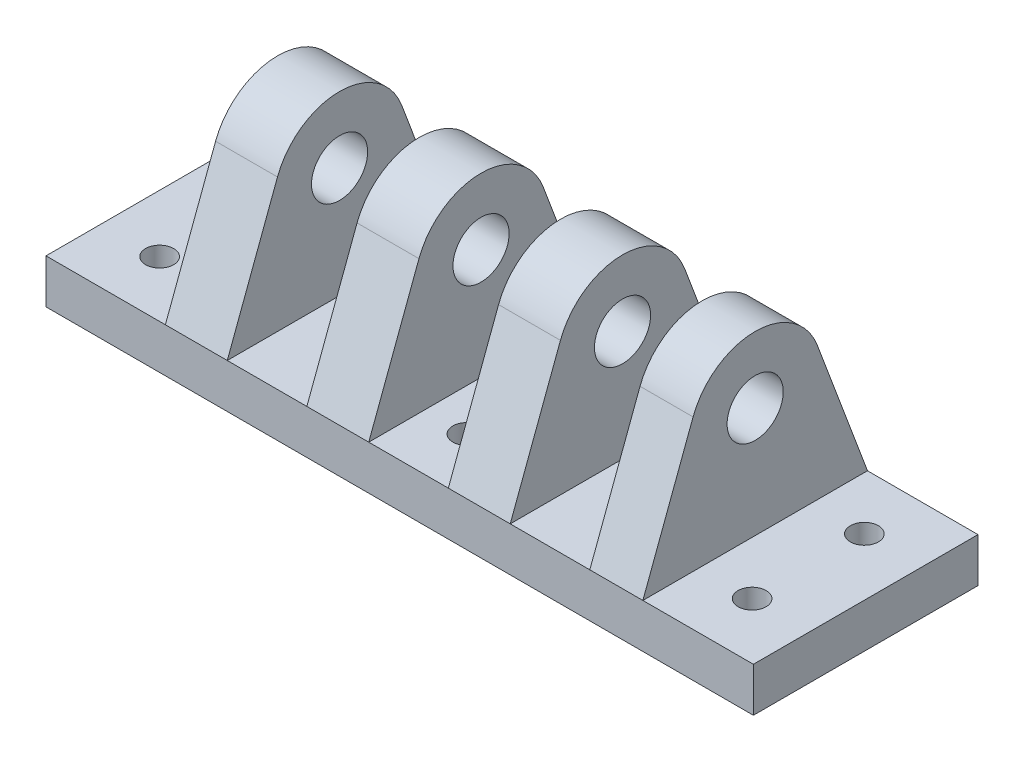
ISO-10303-21;
HEADER;
FILE_DESCRIPTION(('STEP AP214'),'2;1');
FILE_NAME('part.step','',(''),(''),'','','');
FILE_SCHEMA(('AUTOMOTIVE_DESIGN { 1 0 10303 214 1 1 1 1 }'));
ENDSEC;
DATA;
#1=APPLICATION_CONTEXT('core data for automotive mechanical design processes');
#2=APPLICATION_PROTOCOL_DEFINITION('international standard','automotive_design',2000,#1);
#3=PRODUCT_CONTEXT('',#1,'mechanical');
#4=PRODUCT('Part','Part','',(#3));
#5=PRODUCT_RELATED_PRODUCT_CATEGORY('part','',(#4));
#6=PRODUCT_DEFINITION_FORMATION('','',#4);
#7=PRODUCT_DEFINITION_CONTEXT('part definition',#1,'design');
#8=PRODUCT_DEFINITION('design','',#6,#7);
#9=PRODUCT_DEFINITION_SHAPE('','',#8);
#10=(LENGTH_UNIT() NAMED_UNIT(*) SI_UNIT(.MILLI.,.METRE.));
#11=(NAMED_UNIT(*) PLANE_ANGLE_UNIT() SI_UNIT($,.RADIAN.));
#12=(NAMED_UNIT(*) SI_UNIT($,.STERADIAN.) SOLID_ANGLE_UNIT());
#13=UNCERTAINTY_MEASURE_WITH_UNIT(LENGTH_MEASURE(1.E-05),#10,'distance_accuracy_value','');
#14=(GEOMETRIC_REPRESENTATION_CONTEXT(3) GLOBAL_UNCERTAINTY_ASSIGNED_CONTEXT((#13)) GLOBAL_UNIT_ASSIGNED_CONTEXT((#10,
#11,#12)) REPRESENTATION_CONTEXT('',''));
#15=CARTESIAN_POINT('',(0.,0.,0.));
#16=DIRECTION('',(0.,0.,1.));
#17=DIRECTION('',(1.,0.,0.));
#18=AXIS2_PLACEMENT_3D('',#15,#16,#17);
#19=CARTESIAN_POINT('',(160.,10.,-50.8));
#20=DIRECTION('',(0.,0.351258844539415,-0.9362783902947));
#21=DIRECTION('',(0.,0.9362783902947,0.351258844539415));
#22=AXIS2_PLACEMENT_3D('',#19,#20,#21);
#23=PLANE('',#22);
#24=DIRECTION('',(0.,-0.9362783902947,-0.351258844539415));
#25=VECTOR('',#24,1.);
#26=CARTESIAN_POINT('',(27.,10.,-50.8));
#27=LINE('',#26,#25);
#28=CARTESIAN_POINT('',(27.,40.2688826680913,-39.4441758544205));
#29=VERTEX_POINT('',#28);
#30=CARTESIAN_POINT('',(27.,10.,-50.8));
#31=VERTEX_POINT('',#30);
#32=EDGE_CURVE('E185',#29,#31,#27,.T.);
#33=ORIENTED_EDGE('',*,*,#32,.F.);
#34=DIRECTION('',(-1.,0.,0.));
#35=VECTOR('',#34,1.);
#36=CARTESIAN_POINT('',(160.,40.2688826680912,-39.4441758544205));
#37=LINE('',#36,#35);
#38=CARTESIAN_POINT('',(41.,40.2688826680913,-39.4441758544205));
#39=VERTEX_POINT('',#38);
#40=EDGE_CURVE('E290',#39,#29,#37,.T.);
#41=ORIENTED_EDGE('',*,*,#40,.F.);
#42=DIRECTION('',(0.,0.9362783902947,0.351258844539415));
#43=VECTOR('',#42,1.);
#44=CARTESIAN_POINT('',(41.,9.99999999999999,-50.8));
#45=LINE('',#44,#43);
#46=CARTESIAN_POINT('',(41.,10.,-50.8));
#47=VERTEX_POINT('',#46);
#48=EDGE_CURVE('E287',#47,#39,#45,.T.);
#49=ORIENTED_EDGE('',*,*,#48,.F.);
#50=DIRECTION('',(-1.,0.,0.));
#51=VECTOR('',#50,1.);
#52=CARTESIAN_POINT('',(0.,10.,-50.8));
#53=LINE('',#52,#51);
#54=EDGE_CURVE('E198',#47,#31,#53,.T.);
#55=ORIENTED_EDGE('',*,*,#54,.T.);
#56=EDGE_LOOP('',(#33,#41,#49,#55));
#57=FACE_BOUND('',#56,.T.);
#58=ADVANCED_FACE('F37',(#57),#23,.T.);
#59=DIRECTION('',(0.,-0.9362783902947,-0.351258844539415));
#60=VECTOR('',#59,1.);
#61=CARTESIAN_POINT('',(59.,10.,-50.8));
#62=LINE('',#61,#60);
#63=CARTESIAN_POINT('',(59.,40.2688826680913,-39.4441758544205));
#64=VERTEX_POINT('',#63);
#65=CARTESIAN_POINT('',(59.,10.,-50.8));
#66=VERTEX_POINT('',#65);
#67=EDGE_CURVE('E272',#64,#66,#62,.T.);
#68=ORIENTED_EDGE('',*,*,#67,.F.);
#69=CARTESIAN_POINT('',(73.,40.2688826680913,-39.4441758544205));
#70=VERTEX_POINT('',#69);
#71=EDGE_CURVE('E292',#70,#64,#37,.T.);
#72=ORIENTED_EDGE('',*,*,#71,.F.);
#73=DIRECTION('',(0.,0.9362783902947,0.351258844539415));
#74=VECTOR('',#73,1.);
#75=CARTESIAN_POINT('',(73.,10.,-50.8));
#76=LINE('',#75,#74);
#77=CARTESIAN_POINT('',(73.,10.,-50.8));
#78=VERTEX_POINT('',#77);
#79=EDGE_CURVE('E268',#78,#70,#76,.T.);
#80=ORIENTED_EDGE('',*,*,#79,.F.);
#81=EDGE_CURVE('E414',#78,#66,#53,.T.);
#82=ORIENTED_EDGE('',*,*,#81,.T.);
#83=EDGE_LOOP('',(#68,#72,#80,#82));
#84=FACE_BOUND('',#83,.T.);
#85=ADVANCED_FACE('F457',(#84),#23,.T.);
#86=DIRECTION('',(0.,-0.9362783902947,-0.351258844539415));
#87=VECTOR('',#86,1.);
#88=CARTESIAN_POINT('',(91.,10.,-50.8));
#89=LINE('',#88,#87);
#90=CARTESIAN_POINT('',(91.,40.2688826680913,-39.4441758544205));
#91=VERTEX_POINT('',#90);
#92=CARTESIAN_POINT('',(91.,10.,-50.8));
#93=VERTEX_POINT('',#92);
#94=EDGE_CURVE('E264',#91,#93,#89,.T.);
#95=ORIENTED_EDGE('',*,*,#94,.F.);
#96=CARTESIAN_POINT('',(105.,40.2688826680913,-39.4441758544205));
#97=VERTEX_POINT('',#96);
#98=EDGE_CURVE('E298',#97,#91,#37,.T.);
#99=ORIENTED_EDGE('',*,*,#98,.F.);
#100=DIRECTION('',(0.,0.9362783902947,0.351258844539415));
#101=VECTOR('',#100,1.);
#102=CARTESIAN_POINT('',(105.,10.,-50.8));
#103=LINE('',#102,#101);
#104=CARTESIAN_POINT('',(105.,10.,-50.8));
#105=VERTEX_POINT('',#104);
#106=EDGE_CURVE('E259',#105,#97,#103,.T.);
#107=ORIENTED_EDGE('',*,*,#106,.F.);
#108=EDGE_CURVE('E320',#105,#93,#53,.T.);
#109=ORIENTED_EDGE('',*,*,#108,.T.);
#110=EDGE_LOOP('',(#95,#99,#107,#109));
#111=FACE_BOUND('',#110,.T.);
#112=ADVANCED_FACE('F317',(#111),#23,.T.);
#113=CARTESIAN_POINT('',(160.,35.,-25.4));
#114=DIRECTION('',(-1.,0.,0.));
#115=DIRECTION('',(0.,0.,1.));
#116=AXIS2_PLACEMENT_3D('',#113,#114,#115);
#117=CYLINDRICAL_SURFACE('',#116,15.);
#118=CARTESIAN_POINT('',(59.,35.,-25.4));
#119=DIRECTION('',(1.,0.,0.));
#120=DIRECTION('',(0.,0.,-1.));
#121=AXIS2_PLACEMENT_3D('',#118,#119,#120);
#122=CIRCLE('',#121,15.);
#123=CARTESIAN_POINT('',(59.,40.2688826680912,-11.3558241455795));
#124=VERTEX_POINT('',#123);
#125=EDGE_CURVE('E278',#124,#64,#122,.F.);
#126=ORIENTED_EDGE('',*,*,#125,.F.);
#127=DIRECTION('',(-1.,0.,0.));
#128=VECTOR('',#127,1.);
#129=CARTESIAN_POINT('',(160.,40.2688826680912,-11.3558241455795));
#130=LINE('',#129,#128);
#131=CARTESIAN_POINT('',(73.,40.2688826680912,-11.3558241455795));
#132=VERTEX_POINT('',#131);
#133=EDGE_CURVE('E340',#132,#124,#130,.T.);
#134=ORIENTED_EDGE('',*,*,#133,.F.);
#135=CARTESIAN_POINT('',(73.,35.,-25.4));
#136=DIRECTION('',(-1.,0.,0.));
#137=DIRECTION('',(0.,0.,1.));
#138=AXIS2_PLACEMENT_3D('',#135,#136,#137);
#139=CIRCLE('',#138,15.);
#140=EDGE_CURVE('E329',#70,#132,#139,.F.);
#141=ORIENTED_EDGE('',*,*,#140,.F.);
#142=ORIENTED_EDGE('',*,*,#71,.T.);
#143=EDGE_LOOP('',(#126,#134,#141,#142));
#144=FACE_BOUND('',#143,.T.);
#145=ADVANCED_FACE('F443',(#144),#117,.T.);
#146=CARTESIAN_POINT('',(91.,35.,-25.4));
#147=DIRECTION('',(1.,0.,0.));
#148=DIRECTION('',(0.,0.,-1.));
#149=AXIS2_PLACEMENT_3D('',#146,#147,#148);
#150=CIRCLE('',#149,15.);
#151=CARTESIAN_POINT('',(91.,40.2688826680912,-11.3558241455795));
#152=VERTEX_POINT('',#151);
#153=EDGE_CURVE('E311',#152,#91,#150,.F.);
#154=ORIENTED_EDGE('',*,*,#153,.F.);
#155=CARTESIAN_POINT('',(105.,40.2688826680912,-11.3558241455795));
#156=VERTEX_POINT('',#155);
#157=EDGE_CURVE('E300',#156,#152,#130,.T.);
#158=ORIENTED_EDGE('',*,*,#157,.F.);
#159=CARTESIAN_POINT('',(105.,35.,-25.4));
#160=DIRECTION('',(-1.,0.,0.));
#161=DIRECTION('',(0.,0.,1.));
#162=AXIS2_PLACEMENT_3D('',#159,#160,#161);
#163=CIRCLE('',#162,15.);
#164=EDGE_CURVE('E313',#97,#156,#163,.F.);
#165=ORIENTED_EDGE('',*,*,#164,.F.);
#166=ORIENTED_EDGE('',*,*,#98,.T.);
#167=EDGE_LOOP('',(#154,#158,#165,#166));
#168=FACE_BOUND('',#167,.T.);
#169=ADVANCED_FACE('F309',(#168),#117,.T.);
#170=CARTESIAN_POINT('',(123.,35.,-25.4));
#171=DIRECTION('',(1.,0.,0.));
#172=DIRECTION('',(0.,0.,-1.));
#173=AXIS2_PLACEMENT_3D('',#170,#171,#172);
#174=CIRCLE('',#173,15.);
#175=CARTESIAN_POINT('',(123.,40.2688826680912,-11.3558241455795));
#176=VERTEX_POINT('',#175);
#177=CARTESIAN_POINT('',(123.,40.2688826680913,-39.4441758544205));
#178=VERTEX_POINT('',#177);
#179=EDGE_CURVE('E398',#176,#178,#174,.F.);
#180=ORIENTED_EDGE('',*,*,#179,.F.);
#181=CARTESIAN_POINT('',(135.,40.2688826680912,-11.3558241455795));
#182=VERTEX_POINT('',#181);
#183=EDGE_CURVE('E293',#182,#176,#130,.T.);
#184=ORIENTED_EDGE('',*,*,#183,.F.);
#185=CARTESIAN_POINT('',(135.,35.,-25.4));
#186=DIRECTION('',(-1.,0.,0.));
#187=DIRECTION('',(0.,0.,1.));
#188=AXIS2_PLACEMENT_3D('',#185,#186,#187);
#189=CIRCLE('',#188,15.);
#190=CARTESIAN_POINT('',(135.,40.2688826680913,-39.4441758544205));
#191=VERTEX_POINT('',#190);
#192=EDGE_CURVE('E394',#191,#182,#189,.F.);
#193=ORIENTED_EDGE('',*,*,#192,.F.);
#194=EDGE_CURVE('E229',#191,#178,#37,.T.);
#195=ORIENTED_EDGE('',*,*,#194,.T.);
#196=EDGE_LOOP('',(#180,#184,#193,#195));
#197=FACE_BOUND('',#196,.T.);
#198=ADVANCED_FACE('F444',(#197),#117,.T.);
#199=CARTESIAN_POINT('',(160.,10.,0.));
#200=DIRECTION('',(0.,0.351258844539415,0.9362783902947));
#201=DIRECTION('',(0.,-0.936278390294701,0.351258844539415));
#202=AXIS2_PLACEMENT_3D('',#199,#200,#201);
#203=PLANE('',#202);
#204=DIRECTION('',(0.,0.936278390294701,-0.351258844539415));
#205=VECTOR('',#204,1.);
#206=CARTESIAN_POINT('',(27.,10.,0.));
#207=LINE('',#206,#205);
#208=CARTESIAN_POINT('',(27.,10.,0.));
#209=VERTEX_POINT('',#208);
#210=CARTESIAN_POINT('',(27.,40.2688826680912,-11.3558241455795));
#211=VERTEX_POINT('',#210);
#212=EDGE_CURVE('E182',#209,#211,#207,.T.);
#213=ORIENTED_EDGE('',*,*,#212,.F.);
#214=DIRECTION('',(1.,0.,0.));
#215=VECTOR('',#214,1.);
#216=CARTESIAN_POINT('',(0.,10.,0.));
#217=LINE('',#216,#215);
#218=CARTESIAN_POINT('',(41.,10.,0.));
#219=VERTEX_POINT('',#218);
#220=EDGE_CURVE('E199',#209,#219,#217,.T.);
#221=ORIENTED_EDGE('',*,*,#220,.T.);
#222=DIRECTION('',(0.,-0.936278390294701,0.351258844539415));
#223=VECTOR('',#222,1.);
#224=CARTESIAN_POINT('',(41.,9.99999999999998,0.));
#225=LINE('',#224,#223);
#226=CARTESIAN_POINT('',(41.,40.2688826680912,-11.3558241455795));
#227=VERTEX_POINT('',#226);
#228=EDGE_CURVE('E271',#227,#219,#225,.T.);
#229=ORIENTED_EDGE('',*,*,#228,.F.);
#230=EDGE_CURVE('E207',#227,#211,#130,.T.);
#231=ORIENTED_EDGE('',*,*,#230,.T.);
#232=EDGE_LOOP('',(#213,#221,#229,#231));
#233=FACE_BOUND('',#232,.T.);
#234=ADVANCED_FACE('F204',(#233),#203,.T.);
#235=DIRECTION('',(0.,0.936278390294701,-0.351258844539415));
#236=VECTOR('',#235,1.);
#237=CARTESIAN_POINT('',(59.,10.,0.));
#238=LINE('',#237,#236);
#239=CARTESIAN_POINT('',(59.,10.,0.));
#240=VERTEX_POINT('',#239);
#241=EDGE_CURVE('E267',#240,#124,#238,.T.);
#242=ORIENTED_EDGE('',*,*,#241,.F.);
#243=CARTESIAN_POINT('',(73.,10.,0.));
#244=VERTEX_POINT('',#243);
#245=EDGE_CURVE('E215',#240,#244,#217,.T.);
#246=ORIENTED_EDGE('',*,*,#245,.T.);
#247=DIRECTION('',(0.,-0.936278390294701,0.351258844539415));
#248=VECTOR('',#247,1.);
#249=CARTESIAN_POINT('',(73.,10.,0.));
#250=LINE('',#249,#248);
#251=EDGE_CURVE('E263',#132,#244,#250,.T.);
#252=ORIENTED_EDGE('',*,*,#251,.F.);
#253=ORIENTED_EDGE('',*,*,#133,.T.);
#254=EDGE_LOOP('',(#242,#246,#252,#253));
#255=FACE_BOUND('',#254,.T.);
#256=ADVANCED_FACE('F341',(#255),#203,.T.);
#257=DIRECTION('',(0.,0.936278390294701,-0.351258844539415));
#258=VECTOR('',#257,1.);
#259=CARTESIAN_POINT('',(91.,10.,0.));
#260=LINE('',#259,#258);
#261=CARTESIAN_POINT('',(91.,10.,0.));
#262=VERTEX_POINT('',#261);
#263=EDGE_CURVE('E258',#262,#152,#260,.T.);
#264=ORIENTED_EDGE('',*,*,#263,.F.);
#265=CARTESIAN_POINT('',(105.,10.,0.));
#266=VERTEX_POINT('',#265);
#267=EDGE_CURVE('E217',#262,#266,#217,.T.);
#268=ORIENTED_EDGE('',*,*,#267,.T.);
#269=DIRECTION('',(0.,-0.936278390294701,0.351258844539415));
#270=VECTOR('',#269,1.);
#271=CARTESIAN_POINT('',(105.,10.,0.));
#272=LINE('',#271,#270);
#273=EDGE_CURVE('E253',#156,#266,#272,.T.);
#274=ORIENTED_EDGE('',*,*,#273,.F.);
#275=ORIENTED_EDGE('',*,*,#157,.T.);
#276=EDGE_LOOP('',(#264,#268,#274,#275));
#277=FACE_BOUND('',#276,.T.);
#278=ADVANCED_FACE('F348',(#277),#203,.T.);
#279=CARTESIAN_POINT('',(0.,10.,0.));
#280=DIRECTION('',(1.,0.,0.));
#281=DIRECTION('',(0.,0.,-1.));
#282=AXIS2_PLACEMENT_3D('',#279,#280,#281);
#283=PLANE('',#282);
#284=DIRECTION('',(0.,-1.,0.));
#285=VECTOR('',#284,1.);
#286=CARTESIAN_POINT('',(0.,10.,0.));
#287=LINE('',#286,#285);
#288=CARTESIAN_POINT('',(0.,10.,0.));
#289=VERTEX_POINT('',#288);
#290=CARTESIAN_POINT('',(0.,0.,0.));
#291=VERTEX_POINT('',#290);
#292=EDGE_CURVE('E11',#289,#291,#287,.T.);
#293=ORIENTED_EDGE('',*,*,#292,.F.);
#294=DIRECTION('',(0.,0.,-1.));
#295=VECTOR('',#294,1.);
#296=CARTESIAN_POINT('',(0.,10.,0.));
#297=LINE('',#296,#295);
#298=CARTESIAN_POINT('',(0.,10.,-50.8));
#299=VERTEX_POINT('',#298);
#300=EDGE_CURVE('E189',#289,#299,#297,.T.);
#301=ORIENTED_EDGE('',*,*,#300,.T.);
#302=DIRECTION('',(0.,-1.,0.));
#303=VECTOR('',#302,1.);
#304=CARTESIAN_POINT('',(0.,10.,-50.8));
#305=LINE('',#304,#303);
#306=CARTESIAN_POINT('',(0.,0.,-50.8));
#307=VERTEX_POINT('',#306);
#308=EDGE_CURVE('E223',#299,#307,#305,.T.);
#309=ORIENTED_EDGE('',*,*,#308,.T.);
#310=DIRECTION('',(0.,0.,1.));
#311=VECTOR('',#310,1.);
#312=CARTESIAN_POINT('',(0.,0.,0.));
#313=LINE('',#312,#311);
#314=EDGE_CURVE('E225',#307,#291,#313,.T.);
#315=ORIENTED_EDGE('',*,*,#314,.T.);
#316=EDGE_LOOP('',(#293,#301,#309,#315));
#317=FACE_BOUND('',#316,.T.);
#318=ADVANCED_FACE('F39',(#317),#283,.F.);
#319=CARTESIAN_POINT('',(0.,10.,0.));
#320=DIRECTION('',(0.,0.,-1.));
#321=DIRECTION('',(-1.,0.,0.));
#322=AXIS2_PLACEMENT_3D('',#319,#320,#321);
#323=PLANE('',#322);
#324=DIRECTION('',(1.,0.,0.));
#325=VECTOR('',#324,1.);
#326=CARTESIAN_POINT('',(0.,0.,0.));
#327=LINE('',#326,#325);
#328=CARTESIAN_POINT('',(160.,0.,0.));
#329=VERTEX_POINT('',#328);
#330=EDGE_CURVE('E228',#291,#329,#327,.T.);
#331=ORIENTED_EDGE('',*,*,#330,.T.);
#332=DIRECTION('',(0.,-1.,0.));
#333=VECTOR('',#332,1.);
#334=CARTESIAN_POINT('',(160.,10.,0.));
#335=LINE('',#334,#333);
#336=CARTESIAN_POINT('',(160.,10.,0.));
#337=VERTEX_POINT('',#336);
#338=EDGE_CURVE('E46',#337,#329,#335,.T.);
#339=ORIENTED_EDGE('',*,*,#338,.F.);
#340=DIRECTION('',(-1.,0.,0.));
#341=VECTOR('',#340,1.);
#342=CARTESIAN_POINT('',(160.,10.,0.));
#343=LINE('',#342,#341);
#344=CARTESIAN_POINT('',(135.,10.,0.));
#345=VERTEX_POINT('',#344);
#346=EDGE_CURVE('E386',#337,#345,#343,.T.);
#347=ORIENTED_EDGE('',*,*,#346,.T.);
#348=CARTESIAN_POINT('',(123.,10.,0.));
#349=VERTEX_POINT('',#348);
#350=EDGE_CURVE('E201',#349,#345,#217,.T.);
#351=ORIENTED_EDGE('',*,*,#350,.F.);
#352=DIRECTION('',(-1.,0.,0.));
#353=VECTOR('',#352,1.);
#354=CARTESIAN_POINT('',(105.,10.,0.));
#355=LINE('',#354,#353);
#356=EDGE_CURVE('E378',#349,#266,#355,.T.);
#357=ORIENTED_EDGE('',*,*,#356,.T.);
#358=ORIENTED_EDGE('',*,*,#267,.F.);
#359=DIRECTION('',(-1.,0.,0.));
#360=VECTOR('',#359,1.);
#361=CARTESIAN_POINT('',(73.,10.,0.));
#362=LINE('',#361,#360);
#363=EDGE_CURVE('E366',#262,#244,#362,.T.);
#364=ORIENTED_EDGE('',*,*,#363,.T.);
#365=ORIENTED_EDGE('',*,*,#245,.F.);
#366=DIRECTION('',(-1.,0.,0.));
#367=VECTOR('',#366,1.);
#368=CARTESIAN_POINT('',(41.,10.,0.));
#369=LINE('',#368,#367);
#370=EDGE_CURVE('E214',#240,#219,#369,.T.);
#371=ORIENTED_EDGE('',*,*,#370,.T.);
#372=ORIENTED_EDGE('',*,*,#220,.F.);
#373=EDGE_CURVE('E192',#289,#209,#217,.T.);
#374=ORIENTED_EDGE('',*,*,#373,.F.);
#375=ORIENTED_EDGE('',*,*,#292,.T.);
#376=EDGE_LOOP('',(#331,#339,#347,#351,#357,#358,#364,#365,#371,#372,#374,#375));
#377=FACE_BOUND('',#376,.T.);
#378=ADVANCED_FACE('F211',(#377),#323,.F.);
#379=CARTESIAN_POINT('',(160.,10.,0.));
#380=DIRECTION('',(-1.,0.,0.));
#381=DIRECTION('',(0.,0.,1.));
#382=AXIS2_PLACEMENT_3D('',#379,#380,#381);
#383=PLANE('',#382);
#384=DIRECTION('',(0.,-1.,0.));
#385=VECTOR('',#384,1.);
#386=CARTESIAN_POINT('',(160.,10.,-50.8));
#387=LINE('',#386,#385);
#388=CARTESIAN_POINT('',(160.,10.,-50.8));
#389=VERTEX_POINT('',#388);
#390=CARTESIAN_POINT('',(160.,0.,-50.8));
#391=VERTEX_POINT('',#390);
#392=EDGE_CURVE('E237',#389,#391,#387,.T.);
#393=ORIENTED_EDGE('',*,*,#392,.F.);
#394=DIRECTION('',(0.,0.,-1.));
#395=VECTOR('',#394,1.);
#396=CARTESIAN_POINT('',(160.,10.,0.));
#397=LINE('',#396,#395);
#398=EDGE_CURVE('E389',#337,#389,#397,.T.);
#399=ORIENTED_EDGE('',*,*,#398,.F.);
#400=ORIENTED_EDGE('',*,*,#338,.T.);
#401=DIRECTION('',(0.,0.,-1.));
#402=VECTOR('',#401,1.);
#403=CARTESIAN_POINT('',(160.,0.,0.));
#404=LINE('',#403,#402);
#405=EDGE_CURVE('E231',#329,#391,#404,.T.);
#406=ORIENTED_EDGE('',*,*,#405,.T.);
#407=EDGE_LOOP('',(#393,#399,#400,#406));
#408=FACE_BOUND('',#407,.T.);
#409=ADVANCED_FACE('F580',(#408),#383,.F.);
#410=CARTESIAN_POINT('',(0.,10.,-50.8));
#411=DIRECTION('',(0.,0.,1.));
#412=DIRECTION('',(1.,0.,0.));
#413=AXIS2_PLACEMENT_3D('',#410,#411,#412);
#414=PLANE('',#413);
#415=DIRECTION('',(-1.,0.,0.));
#416=VECTOR('',#415,1.);
#417=CARTESIAN_POINT('',(0.,0.,-50.8));
#418=LINE('',#417,#416);
#419=EDGE_CURVE('E233',#391,#307,#418,.T.);
#420=ORIENTED_EDGE('',*,*,#419,.T.);
#421=ORIENTED_EDGE('',*,*,#308,.F.);
#422=DIRECTION('',(-1.,0.,0.));
#423=VECTOR('',#422,1.);
#424=CARTESIAN_POINT('',(0.,10.,-50.8));
#425=LINE('',#424,#423);
#426=EDGE_CURVE('E426',#31,#299,#425,.T.);
#427=ORIENTED_EDGE('',*,*,#426,.F.);
#428=ORIENTED_EDGE('',*,*,#54,.F.);
#429=DIRECTION('',(-1.,0.,0.));
#430=VECTOR('',#429,1.);
#431=CARTESIAN_POINT('',(41.,10.,-50.8));
#432=LINE('',#431,#430);
#433=EDGE_CURVE('E376',#66,#47,#432,.T.);
#434=ORIENTED_EDGE('',*,*,#433,.F.);
#435=ORIENTED_EDGE('',*,*,#81,.F.);
#436=DIRECTION('',(-1.,0.,0.));
#437=VECTOR('',#436,1.);
#438=CARTESIAN_POINT('',(73.,10.,-50.8));
#439=LINE('',#438,#437);
#440=EDGE_CURVE('E370',#93,#78,#439,.T.);
#441=ORIENTED_EDGE('',*,*,#440,.F.);
#442=ORIENTED_EDGE('',*,*,#108,.F.);
#443=DIRECTION('',(-1.,0.,0.));
#444=VECTOR('',#443,1.);
#445=CARTESIAN_POINT('',(105.,10.,-50.8));
#446=LINE('',#445,#444);
#447=CARTESIAN_POINT('',(123.,10.,-50.8));
#448=VERTEX_POINT('',#447);
#449=EDGE_CURVE('E381',#448,#105,#446,.T.);
#450=ORIENTED_EDGE('',*,*,#449,.F.);
#451=CARTESIAN_POINT('',(135.,10.,-50.8));
#452=VERTEX_POINT('',#451);
#453=EDGE_CURVE('E224',#452,#448,#53,.T.);
#454=ORIENTED_EDGE('',*,*,#453,.F.);
#455=EDGE_CURVE('E221',#389,#452,#53,.T.);
#456=ORIENTED_EDGE('',*,*,#455,.F.);
#457=ORIENTED_EDGE('',*,*,#392,.T.);
#458=EDGE_LOOP('',(#420,#421,#427,#428,#434,#435,#441,#442,#450,#454,#456,#457));
#459=FACE_BOUND('',#458,.T.);
#460=ADVANCED_FACE('F410',(#459),#414,.F.);
#461=CARTESIAN_POINT('',(0.,0.,0.));
#462=DIRECTION('',(0.,-1.,0.));
#463=DIRECTION('',(0.,0.,-1.));
#464=AXIS2_PLACEMENT_3D('',#461,#462,#463);
#465=PLANE('',#464);
#466=CARTESIAN_POINT('',(82.5,0.,-38.1));
#467=DIRECTION('',(0.,1.,0.));
#468=DIRECTION('',(0.,0.,1.));
#469=AXIS2_PLACEMENT_3D('',#466,#467,#468);
#470=CIRCLE('',#469,3.175);
#471=CARTESIAN_POINT('',(82.5,0.,-34.925));
#472=VERTEX_POINT('',#471);
#473=EDGE_CURVE('E531',#472,#472,#470,.T.);
#474=ORIENTED_EDGE('',*,*,#473,.T.);
#475=EDGE_LOOP('',(#474));
#476=FACE_BOUND('',#475,.T.);
#477=CARTESIAN_POINT('',(82.5,0.,-12.7));
#478=DIRECTION('',(0.,1.,0.));
#479=DIRECTION('',(0.,0.,1.));
#480=AXIS2_PLACEMENT_3D('',#477,#478,#479);
#481=CIRCLE('',#480,3.175);
#482=CARTESIAN_POINT('',(82.5,0.,-9.52499999999999));
#483=VERTEX_POINT('',#482);
#484=EDGE_CURVE('E541',#483,#483,#481,.T.);
#485=ORIENTED_EDGE('',*,*,#484,.T.);
#486=EDGE_LOOP('',(#485));
#487=FACE_BOUND('',#486,.T.);
#488=CARTESIAN_POINT('',(147.,0.,-12.7));
#489=DIRECTION('',(0.,1.,0.));
#490=DIRECTION('',(0.,0.,1.));
#491=AXIS2_PLACEMENT_3D('',#488,#489,#490);
#492=CIRCLE('',#491,3.17500000000001);
#493=CARTESIAN_POINT('',(147.,0.,-9.52499999999997));
#494=VERTEX_POINT('',#493);
#495=EDGE_CURVE('E547',#494,#494,#492,.T.);
#496=ORIENTED_EDGE('',*,*,#495,.T.);
#497=EDGE_LOOP('',(#496));
#498=FACE_BOUND('',#497,.T.);
#499=CARTESIAN_POINT('',(147.,0.,-38.1));
#500=DIRECTION('',(0.,1.,0.));
#501=DIRECTION('',(0.,0.,1.));
#502=AXIS2_PLACEMENT_3D('',#499,#500,#501);
#503=CIRCLE('',#502,3.17500000000001);
#504=CARTESIAN_POINT('',(147.,0.,-34.925));
#505=VERTEX_POINT('',#504);
#506=EDGE_CURVE('E553',#505,#505,#503,.T.);
#507=ORIENTED_EDGE('',*,*,#506,.T.);
#508=EDGE_LOOP('',(#507));
#509=FACE_BOUND('',#508,.T.);
#510=CARTESIAN_POINT('',(13.,0.,-38.1));
#511=DIRECTION('',(0.,1.,0.));
#512=DIRECTION('',(0.,0.,1.));
#513=AXIS2_PLACEMENT_3D('',#510,#511,#512);
#514=CIRCLE('',#513,3.175);
#515=CARTESIAN_POINT('',(13.,0.,-34.925));
#516=VERTEX_POINT('',#515);
#517=EDGE_CURVE('E559',#516,#516,#514,.T.);
#518=ORIENTED_EDGE('',*,*,#517,.T.);
#519=EDGE_LOOP('',(#518));
#520=FACE_BOUND('',#519,.T.);
#521=CARTESIAN_POINT('',(13.,0.,-12.7));
#522=DIRECTION('',(0.,1.,0.));
#523=DIRECTION('',(0.,0.,1.));
#524=AXIS2_PLACEMENT_3D('',#521,#522,#523);
#525=CIRCLE('',#524,3.175);
#526=CARTESIAN_POINT('',(13.,0.,-9.52499999999999));
#527=VERTEX_POINT('',#526);
#528=EDGE_CURVE('E390',#527,#527,#525,.T.);
#529=ORIENTED_EDGE('',*,*,#528,.T.);
#530=EDGE_LOOP('',(#529));
#531=FACE_BOUND('',#530,.T.);
#532=ORIENTED_EDGE('',*,*,#314,.F.);
#533=ORIENTED_EDGE('',*,*,#419,.F.);
#534=ORIENTED_EDGE('',*,*,#405,.F.);
#535=ORIENTED_EDGE('',*,*,#330,.F.);
#536=EDGE_LOOP('',(#532,#533,#534,#535));
#537=FACE_BOUND('',#536,.T.);
#538=ADVANCED_FACE('F452',(#476,#487,#498,#509,#520,#531,#537),#465,.T.);
#539=DIRECTION('',(0.,-0.9362783902947,-0.351258844539415));
#540=VECTOR('',#539,1.);
#541=CARTESIAN_POINT('',(123.,10.,-50.8));
#542=LINE('',#541,#540);
#543=EDGE_CURVE('E254',#178,#448,#542,.T.);
#544=ORIENTED_EDGE('',*,*,#543,.F.);
#545=ORIENTED_EDGE('',*,*,#194,.F.);
#546=DIRECTION('',(0.,0.9362783902947,0.351258844539415));
#547=VECTOR('',#546,1.);
#548=CARTESIAN_POINT('',(135.,10.,-50.8));
#549=LINE('',#548,#547);
#550=EDGE_CURVE('E249',#452,#191,#549,.T.);
#551=ORIENTED_EDGE('',*,*,#550,.F.);
#552=ORIENTED_EDGE('',*,*,#453,.T.);
#553=EDGE_LOOP('',(#544,#545,#551,#552));
#554=FACE_BOUND('',#553,.T.);
#555=ADVANCED_FACE('F413',(#554),#23,.T.);
#556=CARTESIAN_POINT('',(27.,35.,-25.4));
#557=DIRECTION('',(1.,0.,0.));
#558=DIRECTION('',(0.,1.,0.));
#559=AXIS2_PLACEMENT_3D('',#556,#557,#558);
#560=CIRCLE('',#559,15.);
#561=EDGE_CURVE('E208',#211,#29,#560,.F.);
#562=ORIENTED_EDGE('',*,*,#561,.F.);
#563=ORIENTED_EDGE('',*,*,#230,.F.);
#564=CARTESIAN_POINT('',(41.,35.,-25.4));
#565=DIRECTION('',(-1.,0.,0.));
#566=DIRECTION('',(0.,-1.,0.));
#567=AXIS2_PLACEMENT_3D('',#564,#565,#566);
#568=CIRCLE('',#567,15.);
#569=EDGE_CURVE('E276',#39,#227,#568,.F.);
#570=ORIENTED_EDGE('',*,*,#569,.F.);
#571=ORIENTED_EDGE('',*,*,#40,.T.);
#572=EDGE_LOOP('',(#562,#563,#570,#571));
#573=FACE_BOUND('',#572,.T.);
#574=ADVANCED_FACE('F439',(#573),#117,.T.);
#575=DIRECTION('',(0.,0.936278390294701,-0.351258844539415));
#576=VECTOR('',#575,1.);
#577=CARTESIAN_POINT('',(123.,10.,0.));
#578=LINE('',#577,#576);
#579=EDGE_CURVE('E248',#349,#176,#578,.T.);
#580=ORIENTED_EDGE('',*,*,#579,.F.);
#581=ORIENTED_EDGE('',*,*,#350,.T.);
#582=DIRECTION('',(0.,-0.936278390294701,0.351258844539415));
#583=VECTOR('',#582,1.);
#584=CARTESIAN_POINT('',(135.,10.,0.));
#585=LINE('',#584,#583);
#586=EDGE_CURVE('E244',#182,#345,#585,.T.);
#587=ORIENTED_EDGE('',*,*,#586,.F.);
#588=ORIENTED_EDGE('',*,*,#183,.T.);
#589=EDGE_LOOP('',(#580,#581,#587,#588));
#590=FACE_BOUND('',#589,.T.);
#591=ADVANCED_FACE('F441',(#590),#203,.T.);
#592=CARTESIAN_POINT('',(135.,10.,0.));
#593=DIRECTION('',(-1.,0.,0.));
#594=DIRECTION('',(0.,0.,1.));
#595=AXIS2_PLACEMENT_3D('',#592,#593,#594);
#596=PLANE('',#595);
#597=ORIENTED_EDGE('',*,*,#550,.T.);
#598=ORIENTED_EDGE('',*,*,#192,.T.);
#599=ORIENTED_EDGE('',*,*,#586,.T.);
#600=DIRECTION('',(0.,0.,-1.));
#601=VECTOR('',#600,1.);
#602=CARTESIAN_POINT('',(135.,10.,0.));
#603=LINE('',#602,#601);
#604=EDGE_CURVE('E54',#345,#452,#603,.T.);
#605=ORIENTED_EDGE('',*,*,#604,.T.);
#606=EDGE_LOOP('',(#597,#598,#599,#605));
#607=FACE_BOUND('',#606,.T.);
#608=CARTESIAN_POINT('',(135.,35.,-25.4));
#609=DIRECTION('',(-1.,0.,0.));
#610=DIRECTION('',(0.,0.,1.));
#611=AXIS2_PLACEMENT_3D('',#608,#609,#610);
#612=CIRCLE('',#611,6.35);
#613=CARTESIAN_POINT('',(135.,35.,-19.05));
#614=VERTEX_POINT('',#613);
#615=EDGE_CURVE('E188',#614,#614,#612,.F.);
#616=ORIENTED_EDGE('',*,*,#615,.F.);
#617=EDGE_LOOP('',(#616));
#618=FACE_BOUND('',#617,.T.);
#619=ADVANCED_FACE('F449',(#607,#618),#596,.F.);
#620=CARTESIAN_POINT('',(160.,10.,0.));
#621=DIRECTION('',(0.,-1.,0.));
#622=DIRECTION('',(0.,0.,-1.));
#623=AXIS2_PLACEMENT_3D('',#620,#621,#622);
#624=PLANE('',#623);
#625=CARTESIAN_POINT('',(147.,10.,-12.7));
#626=DIRECTION('',(0.,1.,0.));
#627=DIRECTION('',(0.,0.,1.));
#628=AXIS2_PLACEMENT_3D('',#625,#626,#627);
#629=CIRCLE('',#628,3.17500000000001);
#630=CARTESIAN_POINT('',(147.,10.,-9.52499999999997));
#631=VERTEX_POINT('',#630);
#632=EDGE_CURVE('E544',#631,#631,#629,.T.);
#633=ORIENTED_EDGE('',*,*,#632,.F.);
#634=EDGE_LOOP('',(#633));
#635=FACE_BOUND('',#634,.T.);
#636=CARTESIAN_POINT('',(147.,10.,-38.1));
#637=DIRECTION('',(0.,1.,0.));
#638=DIRECTION('',(0.,0.,1.));
#639=AXIS2_PLACEMENT_3D('',#636,#637,#638);
#640=CIRCLE('',#639,3.17500000000001);
#641=CARTESIAN_POINT('',(147.,10.,-34.925));
#642=VERTEX_POINT('',#641);
#643=EDGE_CURVE('E550',#642,#642,#640,.T.);
#644=ORIENTED_EDGE('',*,*,#643,.F.);
#645=EDGE_LOOP('',(#644));
#646=FACE_BOUND('',#645,.T.);
#647=ORIENTED_EDGE('',*,*,#455,.T.);
#648=ORIENTED_EDGE('',*,*,#604,.F.);
#649=ORIENTED_EDGE('',*,*,#346,.F.);
#650=ORIENTED_EDGE('',*,*,#398,.T.);
#651=EDGE_LOOP('',(#647,#648,#649,#650));
#652=FACE_BOUND('',#651,.T.);
#653=ADVANCED_FACE('F469',(#635,#646,#652),#624,.F.);
#654=CARTESIAN_POINT('',(105.,10.,0.));
#655=DIRECTION('',(-1.,0.,0.));
#656=DIRECTION('',(0.,0.,1.));
#657=AXIS2_PLACEMENT_3D('',#654,#655,#656);
#658=PLANE('',#657);
#659=ORIENTED_EDGE('',*,*,#106,.T.);
#660=ORIENTED_EDGE('',*,*,#164,.T.);
#661=ORIENTED_EDGE('',*,*,#273,.T.);
#662=DIRECTION('',(0.,0.,-1.));
#663=VECTOR('',#662,1.);
#664=CARTESIAN_POINT('',(105.,10.,0.));
#665=LINE('',#664,#663);
#666=EDGE_CURVE('E62',#266,#105,#665,.T.);
#667=ORIENTED_EDGE('',*,*,#666,.T.);
#668=EDGE_LOOP('',(#659,#660,#661,#667));
#669=FACE_BOUND('',#668,.T.);
#670=CARTESIAN_POINT('',(105.,35.,-25.4));
#671=DIRECTION('',(-1.,0.,0.));
#672=DIRECTION('',(0.,0.,1.));
#673=AXIS2_PLACEMENT_3D('',#670,#671,#672);
#674=CIRCLE('',#673,6.35);
#675=CARTESIAN_POINT('',(105.,35.,-19.05));
#676=VERTEX_POINT('',#675);
#677=EDGE_CURVE('E250',#676,#676,#674,.F.);
#678=ORIENTED_EDGE('',*,*,#677,.F.);
#679=EDGE_LOOP('',(#678));
#680=FACE_BOUND('',#679,.T.);
#681=ADVANCED_FACE('F472',(#669,#680),#658,.F.);
#682=CARTESIAN_POINT('',(123.,10.,0.));
#683=DIRECTION('',(1.,0.,0.));
#684=DIRECTION('',(0.,0.,-1.));
#685=AXIS2_PLACEMENT_3D('',#682,#683,#684);
#686=PLANE('',#685);
#687=ORIENTED_EDGE('',*,*,#543,.T.);
#688=DIRECTION('',(0.,0.,-1.));
#689=VECTOR('',#688,1.);
#690=CARTESIAN_POINT('',(123.,10.,0.));
#691=LINE('',#690,#689);
#692=EDGE_CURVE('E380',#349,#448,#691,.T.);
#693=ORIENTED_EDGE('',*,*,#692,.F.);
#694=ORIENTED_EDGE('',*,*,#579,.T.);
#695=ORIENTED_EDGE('',*,*,#179,.T.);
#696=EDGE_LOOP('',(#687,#693,#694,#695));
#697=FACE_BOUND('',#696,.T.);
#698=CARTESIAN_POINT('',(123.,35.,-25.4));
#699=DIRECTION('',(1.,0.,0.));
#700=DIRECTION('',(0.,0.,-1.));
#701=AXIS2_PLACEMENT_3D('',#698,#699,#700);
#702=CIRCLE('',#701,6.35);
#703=CARTESIAN_POINT('',(123.,35.,-31.75));
#704=VERTEX_POINT('',#703);
#705=EDGE_CURVE('E245',#704,#704,#702,.F.);
#706=ORIENTED_EDGE('',*,*,#705,.F.);
#707=EDGE_LOOP('',(#706));
#708=FACE_BOUND('',#707,.T.);
#709=ADVANCED_FACE('F401',(#697,#708),#686,.F.);
#710=CARTESIAN_POINT('',(105.,10.,0.));
#711=DIRECTION('',(0.,-1.,0.));
#712=DIRECTION('',(1.,0.,0.));
#713=AXIS2_PLACEMENT_3D('',#710,#711,#712);
#714=PLANE('',#713);
#715=ORIENTED_EDGE('',*,*,#449,.T.);
#716=ORIENTED_EDGE('',*,*,#666,.F.);
#717=ORIENTED_EDGE('',*,*,#356,.F.);
#718=ORIENTED_EDGE('',*,*,#692,.T.);
#719=EDGE_LOOP('',(#715,#716,#717,#718));
#720=FACE_BOUND('',#719,.T.);
#721=ADVANCED_FACE('F406',(#720),#714,.F.);
#722=CARTESIAN_POINT('',(160.,35.,-25.4));
#723=DIRECTION('',(-1.,0.,0.));
#724=DIRECTION('',(0.,0.,1.));
#725=AXIS2_PLACEMENT_3D('',#722,#723,#724);
#726=CYLINDRICAL_SURFACE('',#725,6.35);
#727=CARTESIAN_POINT('',(91.,35.,-25.4));
#728=DIRECTION('',(1.,0.,0.));
#729=DIRECTION('',(0.,0.,-1.));
#730=AXIS2_PLACEMENT_3D('',#727,#728,#729);
#731=CIRCLE('',#730,6.35);
#732=CARTESIAN_POINT('',(91.,35.,-31.75));
#733=VERTEX_POINT('',#732);
#734=EDGE_CURVE('E255',#733,#733,#731,.F.);
#735=ORIENTED_EDGE('',*,*,#734,.T.);
#736=EDGE_LOOP('',(#735));
#737=FACE_BOUND('',#736,.T.);
#738=ORIENTED_EDGE('',*,*,#677,.T.);
#739=EDGE_LOOP('',(#738));
#740=FACE_BOUND('',#739,.T.);
#741=ADVANCED_FACE('F468',(#737,#740),#726,.F.);
#742=CARTESIAN_POINT('',(73.,10.,0.));
#743=DIRECTION('',(-1.,0.,0.));
#744=DIRECTION('',(0.,0.,1.));
#745=AXIS2_PLACEMENT_3D('',#742,#743,#744);
#746=PLANE('',#745);
#747=ORIENTED_EDGE('',*,*,#79,.T.);
#748=ORIENTED_EDGE('',*,*,#140,.T.);
#749=ORIENTED_EDGE('',*,*,#251,.T.);
#750=DIRECTION('',(0.,0.,-1.));
#751=VECTOR('',#750,1.);
#752=CARTESIAN_POINT('',(73.,10.,0.));
#753=LINE('',#752,#751);
#754=EDGE_CURVE('E365',#244,#78,#753,.T.);
#755=ORIENTED_EDGE('',*,*,#754,.T.);
#756=EDGE_LOOP('',(#747,#748,#749,#755));
#757=FACE_BOUND('',#756,.T.);
#758=CARTESIAN_POINT('',(73.,35.,-25.4));
#759=DIRECTION('',(-1.,0.,0.));
#760=DIRECTION('',(0.,0.,1.));
#761=AXIS2_PLACEMENT_3D('',#758,#759,#760);
#762=CIRCLE('',#761,6.35);
#763=CARTESIAN_POINT('',(73.,35.,-19.05));
#764=VERTEX_POINT('',#763);
#765=EDGE_CURVE('E260',#764,#764,#762,.F.);
#766=ORIENTED_EDGE('',*,*,#765,.F.);
#767=EDGE_LOOP('',(#766));
#768=FACE_BOUND('',#767,.T.);
#769=ADVANCED_FACE('F483',(#757,#768),#746,.F.);
#770=CARTESIAN_POINT('',(91.,10.,0.));
#771=DIRECTION('',(1.,0.,0.));
#772=DIRECTION('',(0.,0.,-1.));
#773=AXIS2_PLACEMENT_3D('',#770,#771,#772);
#774=PLANE('',#773);
#775=ORIENTED_EDGE('',*,*,#94,.T.);
#776=DIRECTION('',(0.,0.,-1.));
#777=VECTOR('',#776,1.);
#778=CARTESIAN_POINT('',(91.,10.,0.));
#779=LINE('',#778,#777);
#780=EDGE_CURVE('E360',#262,#93,#779,.T.);
#781=ORIENTED_EDGE('',*,*,#780,.F.);
#782=ORIENTED_EDGE('',*,*,#263,.T.);
#783=ORIENTED_EDGE('',*,*,#153,.T.);
#784=EDGE_LOOP('',(#775,#781,#782,#783));
#785=FACE_BOUND('',#784,.T.);
#786=ORIENTED_EDGE('',*,*,#734,.F.);
#787=EDGE_LOOP('',(#786));
#788=FACE_BOUND('',#787,.T.);
#789=ADVANCED_FACE('F358',(#785,#788),#774,.F.);
#790=CARTESIAN_POINT('',(73.,10.,0.));
#791=DIRECTION('',(0.,-1.,0.));
#792=DIRECTION('',(1.,0.,0.));
#793=AXIS2_PLACEMENT_3D('',#790,#791,#792);
#794=PLANE('',#793);
#795=CARTESIAN_POINT('',(82.5,10.,-38.1));
#796=DIRECTION('',(0.,1.,0.));
#797=DIRECTION('',(0.,0.,1.));
#798=AXIS2_PLACEMENT_3D('',#795,#796,#797);
#799=CIRCLE('',#798,3.175);
#800=CARTESIAN_POINT('',(82.5,10.,-34.925));
#801=VERTEX_POINT('',#800);
#802=EDGE_CURVE('E534',#801,#801,#799,.T.);
#803=ORIENTED_EDGE('',*,*,#802,.F.);
#804=EDGE_LOOP('',(#803));
#805=FACE_BOUND('',#804,.T.);
#806=CARTESIAN_POINT('',(82.5,10.,-12.7));
#807=DIRECTION('',(0.,1.,0.));
#808=DIRECTION('',(0.,0.,1.));
#809=AXIS2_PLACEMENT_3D('',#806,#807,#808);
#810=CIRCLE('',#809,3.175);
#811=CARTESIAN_POINT('',(82.5,10.,-9.52499999999999));
#812=VERTEX_POINT('',#811);
#813=EDGE_CURVE('E536',#812,#812,#810,.T.);
#814=ORIENTED_EDGE('',*,*,#813,.F.);
#815=EDGE_LOOP('',(#814));
#816=FACE_BOUND('',#815,.T.);
#817=ORIENTED_EDGE('',*,*,#440,.T.);
#818=ORIENTED_EDGE('',*,*,#754,.F.);
#819=ORIENTED_EDGE('',*,*,#363,.F.);
#820=ORIENTED_EDGE('',*,*,#780,.T.);
#821=EDGE_LOOP('',(#817,#818,#819,#820));
#822=FACE_BOUND('',#821,.T.);
#823=ADVANCED_FACE('F369',(#805,#816,#822),#794,.F.);
#824=CARTESIAN_POINT('',(59.,35.,-25.4));
#825=DIRECTION('',(1.,0.,0.));
#826=DIRECTION('',(0.,0.,-1.));
#827=AXIS2_PLACEMENT_3D('',#824,#825,#826);
#828=CIRCLE('',#827,6.35);
#829=CARTESIAN_POINT('',(59.,35.,-31.75));
#830=VERTEX_POINT('',#829);
#831=EDGE_CURVE('E265',#830,#830,#828,.F.);
#832=ORIENTED_EDGE('',*,*,#831,.T.);
#833=EDGE_LOOP('',(#832));
#834=FACE_BOUND('',#833,.T.);
#835=ORIENTED_EDGE('',*,*,#765,.T.);
#836=EDGE_LOOP('',(#835));
#837=FACE_BOUND('',#836,.T.);
#838=ADVANCED_FACE('F491',(#834,#837),#726,.F.);
#839=CARTESIAN_POINT('',(41.,10.,0.));
#840=DIRECTION('',(-1.,0.,0.));
#841=DIRECTION('',(0.,-1.,0.));
#842=AXIS2_PLACEMENT_3D('',#839,#840,#841);
#843=PLANE('',#842);
#844=ORIENTED_EDGE('',*,*,#48,.T.);
#845=ORIENTED_EDGE('',*,*,#569,.T.);
#846=ORIENTED_EDGE('',*,*,#228,.T.);
#847=DIRECTION('',(0.,0.,-1.));
#848=VECTOR('',#847,1.);
#849=CARTESIAN_POINT('',(41.,10.,0.));
#850=LINE('',#849,#848);
#851=EDGE_CURVE('E427',#219,#47,#850,.T.);
#852=ORIENTED_EDGE('',*,*,#851,.T.);
#853=EDGE_LOOP('',(#844,#845,#846,#852));
#854=FACE_BOUND('',#853,.T.);
#855=CARTESIAN_POINT('',(41.,35.,-25.4));
#856=DIRECTION('',(-1.,0.,0.));
#857=DIRECTION('',(0.,-1.,0.));
#858=AXIS2_PLACEMENT_3D('',#855,#856,#857);
#859=CIRCLE('',#858,6.35);
#860=CARTESIAN_POINT('',(41.,28.65,-25.4));
#861=VERTEX_POINT('',#860);
#862=EDGE_CURVE('E269',#861,#861,#859,.F.);
#863=ORIENTED_EDGE('',*,*,#862,.F.);
#864=EDGE_LOOP('',(#863));
#865=FACE_BOUND('',#864,.T.);
#866=ADVANCED_FACE('F437',(#854,#865),#843,.F.);
#867=CARTESIAN_POINT('',(59.,10.,0.));
#868=DIRECTION('',(1.,0.,0.));
#869=DIRECTION('',(0.,0.,-1.));
#870=AXIS2_PLACEMENT_3D('',#867,#868,#869);
#871=PLANE('',#870);
#872=ORIENTED_EDGE('',*,*,#67,.T.);
#873=DIRECTION('',(0.,0.,-1.));
#874=VECTOR('',#873,1.);
#875=CARTESIAN_POINT('',(59.,10.,0.));
#876=LINE('',#875,#874);
#877=EDGE_CURVE('E336',#240,#66,#876,.T.);
#878=ORIENTED_EDGE('',*,*,#877,.F.);
#879=ORIENTED_EDGE('',*,*,#241,.T.);
#880=ORIENTED_EDGE('',*,*,#125,.T.);
#881=EDGE_LOOP('',(#872,#878,#879,#880));
#882=FACE_BOUND('',#881,.T.);
#883=ORIENTED_EDGE('',*,*,#831,.F.);
#884=EDGE_LOOP('',(#883));
#885=FACE_BOUND('',#884,.T.);
#886=ADVANCED_FACE('F334',(#882,#885),#871,.F.);
#887=CARTESIAN_POINT('',(41.,10.,0.));
#888=DIRECTION('',(0.,-1.,0.));
#889=DIRECTION('',(1.,0.,0.));
#890=AXIS2_PLACEMENT_3D('',#887,#888,#889);
#891=PLANE('',#890);
#892=ORIENTED_EDGE('',*,*,#433,.T.);
#893=ORIENTED_EDGE('',*,*,#851,.F.);
#894=ORIENTED_EDGE('',*,*,#370,.F.);
#895=ORIENTED_EDGE('',*,*,#877,.T.);
#896=EDGE_LOOP('',(#892,#893,#894,#895));
#897=FACE_BOUND('',#896,.T.);
#898=ADVANCED_FACE('F435',(#897),#891,.F.);
#899=CARTESIAN_POINT('',(27.,35.,-25.4));
#900=DIRECTION('',(1.,0.,0.));
#901=DIRECTION('',(0.,1.,0.));
#902=AXIS2_PLACEMENT_3D('',#899,#900,#901);
#903=CIRCLE('',#902,6.35);
#904=CARTESIAN_POINT('',(27.,41.35,-25.4));
#905=VERTEX_POINT('',#904);
#906=EDGE_CURVE('E41',#905,#905,#903,.F.);
#907=ORIENTED_EDGE('',*,*,#906,.T.);
#908=EDGE_LOOP('',(#907));
#909=FACE_BOUND('',#908,.T.);
#910=ORIENTED_EDGE('',*,*,#862,.T.);
#911=EDGE_LOOP('',(#910));
#912=FACE_BOUND('',#911,.T.);
#913=ADVANCED_FACE('F467',(#909,#912),#726,.F.);
#914=CARTESIAN_POINT('',(27.,10.,0.));
#915=DIRECTION('',(1.,0.,0.));
#916=DIRECTION('',(0.,1.,0.));
#917=AXIS2_PLACEMENT_3D('',#914,#915,#916);
#918=PLANE('',#917);
#919=ORIENTED_EDGE('',*,*,#32,.T.);
#920=DIRECTION('',(0.,0.,-1.));
#921=VECTOR('',#920,1.);
#922=CARTESIAN_POINT('',(27.,10.,0.));
#923=LINE('',#922,#921);
#924=EDGE_CURVE('E177',#209,#31,#923,.T.);
#925=ORIENTED_EDGE('',*,*,#924,.F.);
#926=ORIENTED_EDGE('',*,*,#212,.T.);
#927=ORIENTED_EDGE('',*,*,#561,.T.);
#928=EDGE_LOOP('',(#919,#925,#926,#927));
#929=FACE_BOUND('',#928,.T.);
#930=ORIENTED_EDGE('',*,*,#906,.F.);
#931=EDGE_LOOP('',(#930));
#932=FACE_BOUND('',#931,.T.);
#933=ADVANCED_FACE('F179',(#929,#932),#918,.F.);
#934=CARTESIAN_POINT('',(0.,10.,0.));
#935=DIRECTION('',(0.,-1.,0.));
#936=DIRECTION('',(0.,0.,-1.));
#937=AXIS2_PLACEMENT_3D('',#934,#935,#936);
#938=PLANE('',#937);
#939=CARTESIAN_POINT('',(13.,10.,-38.1));
#940=DIRECTION('',(0.,1.,0.));
#941=DIRECTION('',(0.,0.,1.));
#942=AXIS2_PLACEMENT_3D('',#939,#940,#941);
#943=CIRCLE('',#942,3.175);
#944=CARTESIAN_POINT('',(13.,10.,-34.925));
#945=VERTEX_POINT('',#944);
#946=EDGE_CURVE('E556',#945,#945,#943,.T.);
#947=ORIENTED_EDGE('',*,*,#946,.F.);
#948=EDGE_LOOP('',(#947));
#949=FACE_BOUND('',#948,.T.);
#950=CARTESIAN_POINT('',(13.,10.,-12.7));
#951=DIRECTION('',(0.,1.,0.));
#952=DIRECTION('',(0.,0.,1.));
#953=AXIS2_PLACEMENT_3D('',#950,#951,#952);
#954=CIRCLE('',#953,3.175);
#955=CARTESIAN_POINT('',(13.,10.,-9.52499999999999));
#956=VERTEX_POINT('',#955);
#957=EDGE_CURVE('E561',#956,#956,#954,.T.);
#958=ORIENTED_EDGE('',*,*,#957,.F.);
#959=EDGE_LOOP('',(#958));
#960=FACE_BOUND('',#959,.T.);
#961=ORIENTED_EDGE('',*,*,#426,.T.);
#962=ORIENTED_EDGE('',*,*,#300,.F.);
#963=ORIENTED_EDGE('',*,*,#373,.T.);
#964=ORIENTED_EDGE('',*,*,#924,.T.);
#965=EDGE_LOOP('',(#961,#962,#963,#964));
#966=FACE_BOUND('',#965,.T.);
#967=ADVANCED_FACE('F193',(#949,#960,#966),#938,.F.);
#968=ORIENTED_EDGE('',*,*,#705,.T.);
#969=EDGE_LOOP('',(#968));
#970=FACE_BOUND('',#969,.T.);
#971=ORIENTED_EDGE('',*,*,#615,.T.);
#972=EDGE_LOOP('',(#971));
#973=FACE_BOUND('',#972,.T.);
#974=ADVANCED_FACE('F462',(#970,#973),#726,.F.);
#975=CARTESIAN_POINT('',(13.,10.,-12.7));
#976=DIRECTION('',(0.,1.,0.));
#977=DIRECTION('',(0.,0.,1.));
#978=AXIS2_PLACEMENT_3D('',#975,#976,#977);
#979=CYLINDRICAL_SURFACE('',#978,3.175);
#980=ORIENTED_EDGE('',*,*,#528,.F.);
#981=EDGE_LOOP('',(#980));
#982=FACE_BOUND('',#981,.T.);
#983=ORIENTED_EDGE('',*,*,#957,.T.);
#984=EDGE_LOOP('',(#983));
#985=FACE_BOUND('',#984,.T.);
#986=ADVANCED_FACE('F465',(#982,#985),#979,.F.);
#987=CARTESIAN_POINT('',(13.,10.,-38.1));
#988=DIRECTION('',(0.,1.,0.));
#989=DIRECTION('',(0.,0.,1.));
#990=AXIS2_PLACEMENT_3D('',#987,#988,#989);
#991=CYLINDRICAL_SURFACE('',#990,3.175);
#992=ORIENTED_EDGE('',*,*,#517,.F.);
#993=EDGE_LOOP('',(#992));
#994=FACE_BOUND('',#993,.T.);
#995=ORIENTED_EDGE('',*,*,#946,.T.);
#996=EDGE_LOOP('',(#995));
#997=FACE_BOUND('',#996,.T.);
#998=ADVANCED_FACE('F506',(#994,#997),#991,.F.);
#999=CARTESIAN_POINT('',(147.,10.,-38.1));
#1000=DIRECTION('',(0.,1.,0.));
#1001=DIRECTION('',(0.,0.,1.));
#1002=AXIS2_PLACEMENT_3D('',#999,#1000,#1001);
#1003=CYLINDRICAL_SURFACE('',#1002,3.17500000000001);
#1004=ORIENTED_EDGE('',*,*,#506,.F.);
#1005=EDGE_LOOP('',(#1004));
#1006=FACE_BOUND('',#1005,.T.);
#1007=ORIENTED_EDGE('',*,*,#643,.T.);
#1008=EDGE_LOOP('',(#1007));
#1009=FACE_BOUND('',#1008,.T.);
#1010=ADVANCED_FACE('F510',(#1006,#1009),#1003,.F.);
#1011=CARTESIAN_POINT('',(147.,10.,-12.7));
#1012=DIRECTION('',(0.,1.,0.));
#1013=DIRECTION('',(0.,0.,1.));
#1014=AXIS2_PLACEMENT_3D('',#1011,#1012,#1013);
#1015=CYLINDRICAL_SURFACE('',#1014,3.17500000000001);
#1016=ORIENTED_EDGE('',*,*,#495,.F.);
#1017=EDGE_LOOP('',(#1016));
#1018=FACE_BOUND('',#1017,.T.);
#1019=ORIENTED_EDGE('',*,*,#632,.T.);
#1020=EDGE_LOOP('',(#1019));
#1021=FACE_BOUND('',#1020,.T.);
#1022=ADVANCED_FACE('F514',(#1018,#1021),#1015,.F.);
#1023=CARTESIAN_POINT('',(82.5,10.,-12.7));
#1024=DIRECTION('',(0.,1.,0.));
#1025=DIRECTION('',(0.,0.,1.));
#1026=AXIS2_PLACEMENT_3D('',#1023,#1024,#1025);
#1027=CYLINDRICAL_SURFACE('',#1026,3.175);
#1028=ORIENTED_EDGE('',*,*,#484,.F.);
#1029=EDGE_LOOP('',(#1028));
#1030=FACE_BOUND('',#1029,.T.);
#1031=ORIENTED_EDGE('',*,*,#813,.T.);
#1032=EDGE_LOOP('',(#1031));
#1033=FACE_BOUND('',#1032,.T.);
#1034=ADVANCED_FACE('F518',(#1030,#1033),#1027,.F.);
#1035=CARTESIAN_POINT('',(82.5,10.,-38.1));
#1036=DIRECTION('',(0.,1.,0.));
#1037=DIRECTION('',(0.,0.,1.));
#1038=AXIS2_PLACEMENT_3D('',#1035,#1036,#1037);
#1039=CYLINDRICAL_SURFACE('',#1038,3.175);
#1040=ORIENTED_EDGE('',*,*,#473,.F.);
#1041=EDGE_LOOP('',(#1040));
#1042=FACE_BOUND('',#1041,.T.);
#1043=ORIENTED_EDGE('',*,*,#802,.T.);
#1044=EDGE_LOOP('',(#1043));
#1045=FACE_BOUND('',#1044,.T.);
#1046=ADVANCED_FACE('F522',(#1042,#1045),#1039,.F.);
#1047=CLOSED_SHELL('',(#58,#85,#112,#145,#169,#198,#234,#256,#278,#318,#378,#409,#460,#538,#555,
#574,#591,#619,#653,#681,#709,#721,#741,#769,#789,#823,#838,#866,#886,#898,#913,#933,#967,#974,
#986,#998,#1010,#1022,#1034,#1046));
#1048=MANIFOLD_SOLID_BREP('B2',#1047);
#1049=ADVANCED_BREP_SHAPE_REPRESENTATION('',(#18,#1048),#14);
#1050=SHAPE_DEFINITION_REPRESENTATION(#9,#1049);
ENDSEC;
END-ISO-10303-21;
